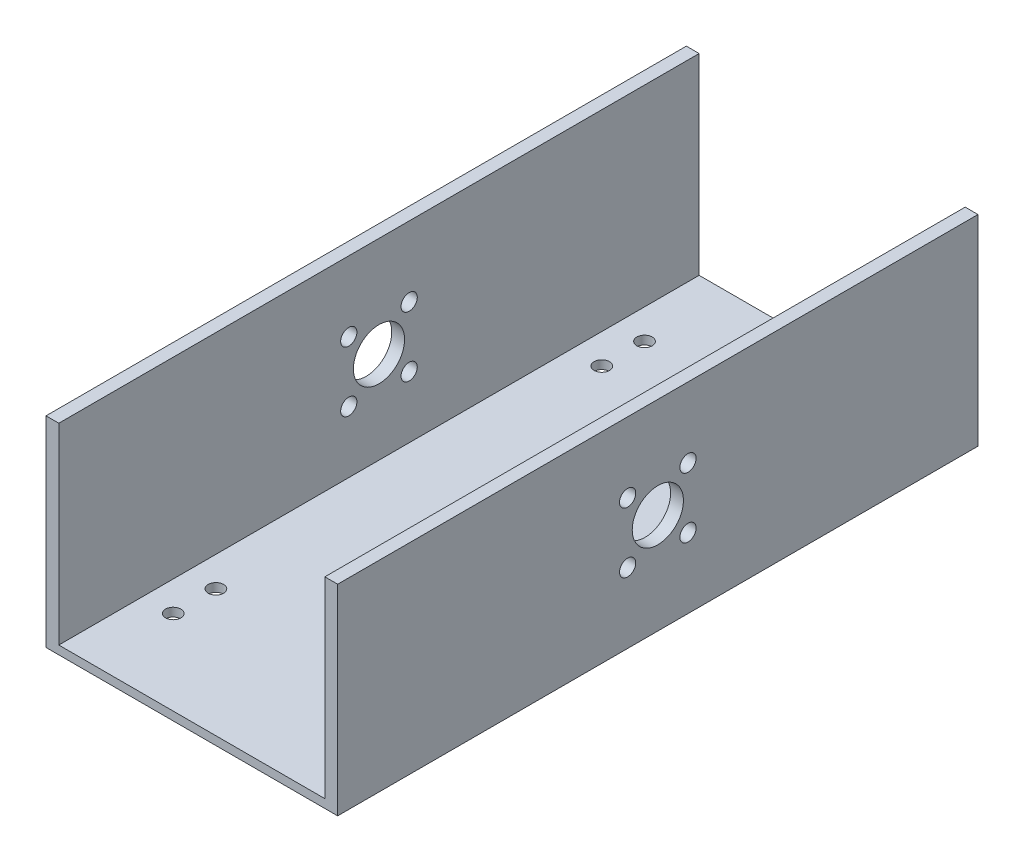
ISO-10303-21;
HEADER;
FILE_DESCRIPTION(('STEP AP214'),'2;1');
FILE_NAME('part.step','',(''),(''),'','','');
FILE_SCHEMA(('AUTOMOTIVE_DESIGN { 1 0 10303 214 1 1 1 1 }'));
ENDSEC;
DATA;
#1=APPLICATION_CONTEXT('core data for automotive mechanical design processes');
#2=APPLICATION_PROTOCOL_DEFINITION('international standard','automotive_design',2000,#1);
#3=PRODUCT_CONTEXT('',#1,'mechanical');
#4=PRODUCT('Part','Part','',(#3));
#5=PRODUCT_RELATED_PRODUCT_CATEGORY('part','',(#4));
#6=PRODUCT_DEFINITION_FORMATION('','',#4);
#7=PRODUCT_DEFINITION_CONTEXT('part definition',#1,'design');
#8=PRODUCT_DEFINITION('design','',#6,#7);
#9=PRODUCT_DEFINITION_SHAPE('','',#8);
#10=(LENGTH_UNIT() NAMED_UNIT(*) SI_UNIT(.MILLI.,.METRE.));
#11=(NAMED_UNIT(*) PLANE_ANGLE_UNIT() SI_UNIT($,.RADIAN.));
#12=(NAMED_UNIT(*) SI_UNIT($,.STERADIAN.) SOLID_ANGLE_UNIT());
#13=UNCERTAINTY_MEASURE_WITH_UNIT(LENGTH_MEASURE(1.E-05),#10,'distance_accuracy_value','');
#14=(GEOMETRIC_REPRESENTATION_CONTEXT(3) GLOBAL_UNCERTAINTY_ASSIGNED_CONTEXT((#13)) GLOBAL_UNIT_ASSIGNED_CONTEXT((#10,
#11,#12)) REPRESENTATION_CONTEXT('',''));
#15=CARTESIAN_POINT('',(0.,0.,0.));
#16=DIRECTION('',(0.,0.,1.));
#17=DIRECTION('',(1.,0.,0.));
#18=AXIS2_PLACEMENT_3D('',#15,#16,#17);
#19=CARTESIAN_POINT('',(0.,2.,0.));
#20=DIRECTION('',(0.,-1.,0.));
#21=DIRECTION('',(0.,0.,-1.));
#22=AXIS2_PLACEMENT_3D('',#19,#20,#21);
#23=PLANE('',#22);
#24=CARTESIAN_POINT('',(-24.16,2.,45.2));
#25=DIRECTION('',(0.,1.,0.));
#26=DIRECTION('',(0.,0.,-1.));
#27=AXIS2_PLACEMENT_3D('',#24,#25,#26);
#28=CIRCLE('',#27,1.8);
#29=CARTESIAN_POINT('',(-24.16,2.,43.4));
#30=VERTEX_POINT('',#29);
#31=EDGE_CURVE('E618',#30,#30,#28,.T.);
#32=ORIENTED_EDGE('',*,*,#31,.F.);
#33=EDGE_LOOP('',(#32));
#34=FACE_BOUND('',#33,.T.);
#35=CARTESIAN_POINT('',(24.16,2.,55.2));
#36=DIRECTION('',(0.,1.,0.));
#37=DIRECTION('',(0.,0.,-1.));
#38=AXIS2_PLACEMENT_3D('',#35,#36,#37);
#39=CIRCLE('',#38,1.8);
#40=CARTESIAN_POINT('',(24.16,2.,53.4));
#41=VERTEX_POINT('',#40);
#42=EDGE_CURVE('E606',#41,#41,#39,.T.);
#43=ORIENTED_EDGE('',*,*,#42,.F.);
#44=EDGE_LOOP('',(#43));
#45=FACE_BOUND('',#44,.T.);
#46=CARTESIAN_POINT('',(-24.16,2.,55.2));
#47=DIRECTION('',(0.,1.,0.));
#48=DIRECTION('',(0.,0.,-1.));
#49=AXIS2_PLACEMENT_3D('',#46,#47,#48);
#50=CIRCLE('',#49,1.8);
#51=CARTESIAN_POINT('',(-24.16,2.,53.4));
#52=VERTEX_POINT('',#51);
#53=EDGE_CURVE('E595',#52,#52,#50,.T.);
#54=ORIENTED_EDGE('',*,*,#53,.F.);
#55=EDGE_LOOP('',(#54));
#56=FACE_BOUND('',#55,.T.);
#57=CARTESIAN_POINT('',(24.16,2.,-45.2));
#58=DIRECTION('',(0.,1.,0.));
#59=DIRECTION('',(0.,0.,1.));
#60=AXIS2_PLACEMENT_3D('',#57,#58,#59);
#61=CIRCLE('',#60,1.79999999999999);
#62=CARTESIAN_POINT('',(24.16,2.,-43.4));
#63=VERTEX_POINT('',#62);
#64=EDGE_CURVE('E173',#63,#63,#61,.T.);
#65=ORIENTED_EDGE('',*,*,#64,.F.);
#66=EDGE_LOOP('',(#65));
#67=FACE_BOUND('',#66,.T.);
#68=CARTESIAN_POINT('',(24.16,2.,-55.2));
#69=DIRECTION('',(0.,1.,0.));
#70=DIRECTION('',(0.,0.,1.));
#71=AXIS2_PLACEMENT_3D('',#68,#69,#70);
#72=CIRCLE('',#71,1.8);
#73=CARTESIAN_POINT('',(24.16,2.,-53.4));
#74=VERTEX_POINT('',#73);
#75=EDGE_CURVE('E588',#74,#74,#72,.T.);
#76=ORIENTED_EDGE('',*,*,#75,.F.);
#77=EDGE_LOOP('',(#76));
#78=FACE_BOUND('',#77,.T.);
#79=CARTESIAN_POINT('',(-24.16,2.,-45.2));
#80=DIRECTION('',(0.,1.,0.));
#81=DIRECTION('',(0.,0.,1.));
#82=AXIS2_PLACEMENT_3D('',#79,#80,#81);
#83=CIRCLE('',#82,1.8);
#84=CARTESIAN_POINT('',(-24.16,2.,-43.4));
#85=VERTEX_POINT('',#84);
#86=EDGE_CURVE('E600',#85,#85,#83,.T.);
#87=ORIENTED_EDGE('',*,*,#86,.F.);
#88=EDGE_LOOP('',(#87));
#89=FACE_BOUND('',#88,.T.);
#90=CARTESIAN_POINT('',(-24.16,2.,-55.2));
#91=DIRECTION('',(0.,1.,0.));
#92=DIRECTION('',(0.,0.,1.));
#93=AXIS2_PLACEMENT_3D('',#90,#91,#92);
#94=CIRCLE('',#93,1.8);
#95=CARTESIAN_POINT('',(-24.16,2.,-53.4));
#96=VERTEX_POINT('',#95);
#97=EDGE_CURVE('E612',#96,#96,#94,.T.);
#98=ORIENTED_EDGE('',*,*,#97,.F.);
#99=EDGE_LOOP('',(#98));
#100=FACE_BOUND('',#99,.T.);
#101=CARTESIAN_POINT('',(24.16,2.,45.2));
#102=DIRECTION('',(0.,1.,0.));
#103=DIRECTION('',(0.,0.,-1.));
#104=AXIS2_PLACEMENT_3D('',#101,#102,#103);
#105=CIRCLE('',#104,1.79999999999999);
#106=CARTESIAN_POINT('',(24.16,2.,43.4));
#107=VERTEX_POINT('',#106);
#108=EDGE_CURVE('E144',#107,#107,#105,.T.);
#109=ORIENTED_EDGE('',*,*,#108,.F.);
#110=EDGE_LOOP('',(#109));
#111=FACE_BOUND('',#110,.T.);
#112=DIRECTION('',(0.,0.,1.));
#113=VECTOR('',#112,1.);
#114=CARTESIAN_POINT('',(31.16,2.,-75.));
#115=LINE('',#114,#113);
#116=CARTESIAN_POINT('',(31.16,2.,-75.));
#117=VERTEX_POINT('',#116);
#118=CARTESIAN_POINT('',(31.16,2.,75.));
#119=VERTEX_POINT('',#118);
#120=EDGE_CURVE('E105',#117,#119,#115,.T.);
#121=ORIENTED_EDGE('',*,*,#120,.F.);
#122=DIRECTION('',(-1.,0.,0.));
#123=VECTOR('',#122,1.);
#124=CARTESIAN_POINT('',(34.16,2.,-75.));
#125=LINE('',#124,#123);
#126=CARTESIAN_POINT('',(-31.16,2.,-75.));
#127=VERTEX_POINT('',#126);
#128=EDGE_CURVE('E159',#117,#127,#125,.T.);
#129=ORIENTED_EDGE('',*,*,#128,.T.);
#130=DIRECTION('',(0.,0.,-1.));
#131=VECTOR('',#130,1.);
#132=CARTESIAN_POINT('',(-31.16,2.,-75.));
#133=LINE('',#132,#131);
#134=CARTESIAN_POINT('',(-31.16,2.,75.));
#135=VERTEX_POINT('',#134);
#136=EDGE_CURVE('E55',#135,#127,#133,.T.);
#137=ORIENTED_EDGE('',*,*,#136,.F.);
#138=DIRECTION('',(1.,0.,0.));
#139=VECTOR('',#138,1.);
#140=CARTESIAN_POINT('',(34.16,2.,75.));
#141=LINE('',#140,#139);
#142=EDGE_CURVE('E50',#135,#119,#141,.T.);
#143=ORIENTED_EDGE('',*,*,#142,.T.);
#144=EDGE_LOOP('',(#121,#129,#137,#143));
#145=FACE_BOUND('',#144,.T.);
#146=ADVANCED_FACE('F33',(#34,#45,#56,#67,#78,#89,#100,#111,#145),#23,.F.);
#147=CARTESIAN_POINT('',(0.,0.,0.));
#148=DIRECTION('',(0.,-1.,0.));
#149=DIRECTION('',(0.,0.,-1.));
#150=AXIS2_PLACEMENT_3D('',#147,#148,#149);
#151=PLANE('',#150);
#152=CARTESIAN_POINT('',(-24.16,0.,45.2));
#153=DIRECTION('',(0.,1.,0.));
#154=DIRECTION('',(0.,0.,-1.));
#155=AXIS2_PLACEMENT_3D('',#152,#153,#154);
#156=CIRCLE('',#155,1.8);
#157=CARTESIAN_POINT('',(-24.16,0.,43.4));
#158=VERTEX_POINT('',#157);
#159=EDGE_CURVE('E621',#158,#158,#156,.T.);
#160=ORIENTED_EDGE('',*,*,#159,.T.);
#161=EDGE_LOOP('',(#160));
#162=FACE_BOUND('',#161,.T.);
#163=CARTESIAN_POINT('',(24.16,0.,55.2));
#164=DIRECTION('',(0.,1.,0.));
#165=DIRECTION('',(0.,0.,-1.));
#166=AXIS2_PLACEMENT_3D('',#163,#164,#165);
#167=CIRCLE('',#166,1.8);
#168=CARTESIAN_POINT('',(24.16,0.,53.4));
#169=VERTEX_POINT('',#168);
#170=EDGE_CURVE('E609',#169,#169,#167,.T.);
#171=ORIENTED_EDGE('',*,*,#170,.T.);
#172=EDGE_LOOP('',(#171));
#173=FACE_BOUND('',#172,.T.);
#174=CARTESIAN_POINT('',(-24.16,0.,55.2));
#175=DIRECTION('',(0.,1.,0.));
#176=DIRECTION('',(0.,0.,-1.));
#177=AXIS2_PLACEMENT_3D('',#174,#175,#176);
#178=CIRCLE('',#177,1.8);
#179=CARTESIAN_POINT('',(-24.16,0.,53.4));
#180=VERTEX_POINT('',#179);
#181=EDGE_CURVE('E597',#180,#180,#178,.T.);
#182=ORIENTED_EDGE('',*,*,#181,.T.);
#183=EDGE_LOOP('',(#182));
#184=FACE_BOUND('',#183,.T.);
#185=CARTESIAN_POINT('',(24.16,0.,-45.2));
#186=DIRECTION('',(0.,1.,0.));
#187=DIRECTION('',(0.,0.,1.));
#188=AXIS2_PLACEMENT_3D('',#185,#186,#187);
#189=CIRCLE('',#188,1.79999999999999);
#190=CARTESIAN_POINT('',(24.16,0.,-43.4));
#191=VERTEX_POINT('',#190);
#192=EDGE_CURVE('E586',#191,#191,#189,.T.);
#193=ORIENTED_EDGE('',*,*,#192,.T.);
#194=EDGE_LOOP('',(#193));
#195=FACE_BOUND('',#194,.T.);
#196=DIRECTION('',(0.,0.,1.));
#197=VECTOR('',#196,1.);
#198=CARTESIAN_POINT('',(-34.16,0.,-75.));
#199=LINE('',#198,#197);
#200=CARTESIAN_POINT('',(-34.16,0.,-75.));
#201=VERTEX_POINT('',#200);
#202=CARTESIAN_POINT('',(-34.16,0.,75.));
#203=VERTEX_POINT('',#202);
#204=EDGE_CURVE('E169',#201,#203,#199,.T.);
#205=ORIENTED_EDGE('',*,*,#204,.F.);
#206=DIRECTION('',(-1.,0.,0.));
#207=VECTOR('',#206,1.);
#208=CARTESIAN_POINT('',(34.16,0.,-75.));
#209=LINE('',#208,#207);
#210=CARTESIAN_POINT('',(34.16,0.,-75.));
#211=VERTEX_POINT('',#210);
#212=EDGE_CURVE('E177',#211,#201,#209,.T.);
#213=ORIENTED_EDGE('',*,*,#212,.F.);
#214=DIRECTION('',(0.,0.,-1.));
#215=VECTOR('',#214,1.);
#216=CARTESIAN_POINT('',(34.16,0.,-75.));
#217=LINE('',#216,#215);
#218=CARTESIAN_POINT('',(34.16,0.,75.));
#219=VERTEX_POINT('',#218);
#220=EDGE_CURVE('E175',#219,#211,#217,.T.);
#221=ORIENTED_EDGE('',*,*,#220,.F.);
#222=DIRECTION('',(1.,0.,0.));
#223=VECTOR('',#222,1.);
#224=CARTESIAN_POINT('',(34.16,0.,75.));
#225=LINE('',#224,#223);
#226=EDGE_CURVE('E172',#203,#219,#225,.T.);
#227=ORIENTED_EDGE('',*,*,#226,.F.);
#228=EDGE_LOOP('',(#205,#213,#221,#227));
#229=FACE_BOUND('',#228,.T.);
#230=CARTESIAN_POINT('',(24.16,0.,-55.2));
#231=DIRECTION('',(0.,1.,0.));
#232=DIRECTION('',(0.,0.,1.));
#233=AXIS2_PLACEMENT_3D('',#230,#231,#232);
#234=CIRCLE('',#233,1.8);
#235=CARTESIAN_POINT('',(24.16,0.,-53.4));
#236=VERTEX_POINT('',#235);
#237=EDGE_CURVE('E591',#236,#236,#234,.T.);
#238=ORIENTED_EDGE('',*,*,#237,.T.);
#239=EDGE_LOOP('',(#238));
#240=FACE_BOUND('',#239,.T.);
#241=CARTESIAN_POINT('',(-24.16,0.,-45.2));
#242=DIRECTION('',(0.,1.,0.));
#243=DIRECTION('',(0.,0.,1.));
#244=AXIS2_PLACEMENT_3D('',#241,#242,#243);
#245=CIRCLE('',#244,1.8);
#246=CARTESIAN_POINT('',(-24.16,0.,-43.4));
#247=VERTEX_POINT('',#246);
#248=EDGE_CURVE('E603',#247,#247,#245,.T.);
#249=ORIENTED_EDGE('',*,*,#248,.T.);
#250=EDGE_LOOP('',(#249));
#251=FACE_BOUND('',#250,.T.);
#252=CARTESIAN_POINT('',(-24.16,0.,-55.2));
#253=DIRECTION('',(0.,1.,0.));
#254=DIRECTION('',(0.,0.,1.));
#255=AXIS2_PLACEMENT_3D('',#252,#253,#254);
#256=CIRCLE('',#255,1.8);
#257=CARTESIAN_POINT('',(-24.16,0.,-53.4));
#258=VERTEX_POINT('',#257);
#259=EDGE_CURVE('E615',#258,#258,#256,.T.);
#260=ORIENTED_EDGE('',*,*,#259,.T.);
#261=EDGE_LOOP('',(#260));
#262=FACE_BOUND('',#261,.T.);
#263=CARTESIAN_POINT('',(24.16,0.,45.2));
#264=DIRECTION('',(0.,1.,0.));
#265=DIRECTION('',(0.,0.,-1.));
#266=AXIS2_PLACEMENT_3D('',#263,#264,#265);
#267=CIRCLE('',#266,1.79999999999999);
#268=CARTESIAN_POINT('',(24.16,0.,43.4));
#269=VERTEX_POINT('',#268);
#270=EDGE_CURVE('E156',#269,#269,#267,.T.);
#271=ORIENTED_EDGE('',*,*,#270,.T.);
#272=EDGE_LOOP('',(#271));
#273=FACE_BOUND('',#272,.T.);
#274=ADVANCED_FACE('F190',(#162,#173,#184,#195,#229,#240,#251,#262,#273),#151,.T.);
#275=CARTESIAN_POINT('',(-34.16,2.,-75.));
#276=DIRECTION('',(1.,0.,0.));
#277=DIRECTION('',(0.,0.,-1.));
#278=AXIS2_PLACEMENT_3D('',#275,#276,#277);
#279=PLANE('',#278);
#280=CARTESIAN_POINT('',(-34.16,16.4289321881345,7.0710678118655));
#281=DIRECTION('',(-1.,0.,0.));
#282=DIRECTION('',(0.,-1.,0.));
#283=AXIS2_PLACEMENT_3D('',#280,#281,#282);
#284=CIRCLE('',#283,1.89999999999999);
#285=CARTESIAN_POINT('',(-34.16,14.5289321881345,7.07106781186552));
#286=VERTEX_POINT('',#285);
#287=EDGE_CURVE('E247',#286,#286,#284,.T.);
#288=ORIENTED_EDGE('',*,*,#287,.F.);
#289=EDGE_LOOP('',(#288));
#290=FACE_BOUND('',#289,.T.);
#291=CARTESIAN_POINT('',(-34.16,16.4289321881346,-7.07106781186554));
#292=DIRECTION('',(-1.,0.,0.));
#293=DIRECTION('',(0.,0.,-1.));
#294=AXIS2_PLACEMENT_3D('',#291,#292,#293);
#295=CIRCLE('',#294,1.89999999999999);
#296=CARTESIAN_POINT('',(-34.16,16.4289321881346,-8.97106781186554));
#297=VERTEX_POINT('',#296);
#298=EDGE_CURVE('E251',#297,#297,#295,.T.);
#299=ORIENTED_EDGE('',*,*,#298,.F.);
#300=EDGE_LOOP('',(#299));
#301=FACE_BOUND('',#300,.T.);
#302=CARTESIAN_POINT('',(-34.16,30.5710678118655,-7.07106781186547));
#303=DIRECTION('',(-1.,0.,0.));
#304=DIRECTION('',(0.,1.,0.));
#305=AXIS2_PLACEMENT_3D('',#302,#303,#304);
#306=CIRCLE('',#305,1.89999999999999);
#307=CARTESIAN_POINT('',(-34.16,32.4710678118655,-7.07106781186548));
#308=VERTEX_POINT('',#307);
#309=EDGE_CURVE('E255',#308,#308,#306,.T.);
#310=ORIENTED_EDGE('',*,*,#309,.F.);
#311=EDGE_LOOP('',(#310));
#312=FACE_BOUND('',#311,.T.);
#313=CARTESIAN_POINT('',(-34.16,30.5710678118654,7.07106781186552));
#314=DIRECTION('',(-1.,0.,0.));
#315=DIRECTION('',(0.,0.,1.));
#316=AXIS2_PLACEMENT_3D('',#313,#314,#315);
#317=CIRCLE('',#316,1.89999999999999);
#318=CARTESIAN_POINT('',(-34.16,30.5710678118654,8.97106781186551));
#319=VERTEX_POINT('',#318);
#320=EDGE_CURVE('E259',#319,#319,#317,.T.);
#321=ORIENTED_EDGE('',*,*,#320,.F.);
#322=EDGE_LOOP('',(#321));
#323=FACE_BOUND('',#322,.T.);
#324=CARTESIAN_POINT('',(-34.16,23.5,0.));
#325=DIRECTION('',(-1.,0.,0.));
#326=DIRECTION('',(0.,0.,1.));
#327=AXIS2_PLACEMENT_3D('',#324,#325,#326);
#328=CIRCLE('',#327,6.);
#329=CARTESIAN_POINT('',(-34.16,23.5,5.99999999999999));
#330=VERTEX_POINT('',#329);
#331=EDGE_CURVE('E262',#330,#330,#328,.T.);
#332=ORIENTED_EDGE('',*,*,#331,.F.);
#333=EDGE_LOOP('',(#332));
#334=FACE_BOUND('',#333,.T.);
#335=ORIENTED_EDGE('',*,*,#204,.T.);
#336=DIRECTION('',(0.,-1.,0.));
#337=VECTOR('',#336,1.);
#338=CARTESIAN_POINT('',(-34.16,2.,75.));
#339=LINE('',#338,#337);
#340=CARTESIAN_POINT('',(-34.16,47.,75.));
#341=VERTEX_POINT('',#340);
#342=EDGE_CURVE('E11',#341,#203,#339,.T.);
#343=ORIENTED_EDGE('',*,*,#342,.F.);
#344=DIRECTION('',(0.,0.,1.));
#345=VECTOR('',#344,1.);
#346=CARTESIAN_POINT('',(-34.16,47.,-75.));
#347=LINE('',#346,#345);
#348=CARTESIAN_POINT('',(-34.16,47.,-75.));
#349=VERTEX_POINT('',#348);
#350=EDGE_CURVE('E122',#349,#341,#347,.T.);
#351=ORIENTED_EDGE('',*,*,#350,.F.);
#352=DIRECTION('',(0.,-1.,0.));
#353=VECTOR('',#352,1.);
#354=CARTESIAN_POINT('',(-34.16,2.,-75.));
#355=LINE('',#354,#353);
#356=EDGE_CURVE('E162',#349,#201,#355,.T.);
#357=ORIENTED_EDGE('',*,*,#356,.T.);
#358=EDGE_LOOP('',(#335,#343,#351,#357));
#359=FACE_BOUND('',#358,.T.);
#360=ADVANCED_FACE('F35',(#290,#301,#312,#323,#334,#359),#279,.F.);
#361=CARTESIAN_POINT('',(34.16,2.,75.));
#362=DIRECTION('',(0.,0.,-1.));
#363=DIRECTION('',(-1.,0.,0.));
#364=AXIS2_PLACEMENT_3D('',#361,#362,#363);
#365=PLANE('',#364);
#366=ORIENTED_EDGE('',*,*,#226,.T.);
#367=DIRECTION('',(0.,-1.,0.));
#368=VECTOR('',#367,1.);
#369=CARTESIAN_POINT('',(34.16,2.,75.));
#370=LINE('',#369,#368);
#371=CARTESIAN_POINT('',(34.16,47.,75.));
#372=VERTEX_POINT('',#371);
#373=EDGE_CURVE('E42',#372,#219,#370,.T.);
#374=ORIENTED_EDGE('',*,*,#373,.F.);
#375=DIRECTION('',(1.,0.,0.));
#376=VECTOR('',#375,1.);
#377=CARTESIAN_POINT('',(34.16,47.,75.));
#378=LINE('',#377,#376);
#379=CARTESIAN_POINT('',(31.16,47.,75.));
#380=VERTEX_POINT('',#379);
#381=EDGE_CURVE('E107',#380,#372,#378,.T.);
#382=ORIENTED_EDGE('',*,*,#381,.F.);
#383=DIRECTION('',(0.,-1.,0.));
#384=VECTOR('',#383,1.);
#385=CARTESIAN_POINT('',(31.16,197.0299970006,75.));
#386=LINE('',#385,#384);
#387=EDGE_CURVE('E98',#380,#119,#386,.T.);
#388=ORIENTED_EDGE('',*,*,#387,.T.);
#389=ORIENTED_EDGE('',*,*,#142,.F.);
#390=DIRECTION('',(0.,-1.,0.));
#391=VECTOR('',#390,1.);
#392=CARTESIAN_POINT('',(-31.16,47.,75.));
#393=LINE('',#392,#391);
#394=CARTESIAN_POINT('',(-31.16,47.,75.));
#395=VERTEX_POINT('',#394);
#396=EDGE_CURVE('E151',#395,#135,#393,.T.);
#397=ORIENTED_EDGE('',*,*,#396,.F.);
#398=DIRECTION('',(1.,0.,0.));
#399=VECTOR('',#398,1.);
#400=CARTESIAN_POINT('',(-34.16,47.,75.));
#401=LINE('',#400,#399);
#402=EDGE_CURVE('E134',#341,#395,#401,.T.);
#403=ORIENTED_EDGE('',*,*,#402,.F.);
#404=ORIENTED_EDGE('',*,*,#342,.T.);
#405=EDGE_LOOP('',(#366,#374,#382,#388,#389,#397,#403,#404));
#406=FACE_BOUND('',#405,.T.);
#407=ADVANCED_FACE('F110',(#406),#365,.F.);
#408=CARTESIAN_POINT('',(34.16,2.,-75.));
#409=DIRECTION('',(-1.,0.,0.));
#410=DIRECTION('',(0.,0.,1.));
#411=AXIS2_PLACEMENT_3D('',#408,#409,#410);
#412=PLANE('',#411);
#413=CARTESIAN_POINT('',(34.16,16.4289321881345,7.07106781186549));
#414=DIRECTION('',(-1.,0.,0.));
#415=DIRECTION('',(0.,-1.,0.));
#416=AXIS2_PLACEMENT_3D('',#413,#414,#415);
#417=CIRCLE('',#416,1.89999999999999);
#418=CARTESIAN_POINT('',(34.16,14.5289321881345,7.07106781186551));
#419=VERTEX_POINT('',#418);
#420=EDGE_CURVE('E560',#419,#419,#417,.T.);
#421=ORIENTED_EDGE('',*,*,#420,.T.);
#422=EDGE_LOOP('',(#421));
#423=FACE_BOUND('',#422,.T.);
#424=CARTESIAN_POINT('',(34.16,16.4289321881346,-7.07106781186555));
#425=DIRECTION('',(-1.,0.,0.));
#426=DIRECTION('',(0.,0.,-1.));
#427=AXIS2_PLACEMENT_3D('',#424,#425,#426);
#428=CIRCLE('',#427,1.89999999999999);
#429=CARTESIAN_POINT('',(34.16,16.4289321881346,-8.97106781186554));
#430=VERTEX_POINT('',#429);
#431=EDGE_CURVE('E320',#430,#430,#428,.T.);
#432=ORIENTED_EDGE('',*,*,#431,.T.);
#433=EDGE_LOOP('',(#432));
#434=FACE_BOUND('',#433,.T.);
#435=CARTESIAN_POINT('',(34.16,30.5710678118655,-7.07106781186548));
#436=DIRECTION('',(-1.,0.,0.));
#437=DIRECTION('',(0.,1.,0.));
#438=AXIS2_PLACEMENT_3D('',#435,#436,#437);
#439=CIRCLE('',#438,1.89999999999999);
#440=CARTESIAN_POINT('',(34.16,32.4710678118655,-7.07106781186549));
#441=VERTEX_POINT('',#440);
#442=EDGE_CURVE('E318',#441,#441,#439,.T.);
#443=ORIENTED_EDGE('',*,*,#442,.T.);
#444=EDGE_LOOP('',(#443));
#445=FACE_BOUND('',#444,.T.);
#446=CARTESIAN_POINT('',(34.16,30.5710678118654,7.07106781186551));
#447=DIRECTION('',(-1.,0.,0.));
#448=DIRECTION('',(0.,0.,1.));
#449=AXIS2_PLACEMENT_3D('',#446,#447,#448);
#450=CIRCLE('',#449,1.89999999999999);
#451=CARTESIAN_POINT('',(34.16,30.5710678118654,8.9710678118655));
#452=VERTEX_POINT('',#451);
#453=EDGE_CURVE('E313',#452,#452,#450,.T.);
#454=ORIENTED_EDGE('',*,*,#453,.T.);
#455=EDGE_LOOP('',(#454));
#456=FACE_BOUND('',#455,.T.);
#457=CARTESIAN_POINT('',(34.16,23.5,0.));
#458=DIRECTION('',(-1.,0.,0.));
#459=DIRECTION('',(0.,0.,1.));
#460=AXIS2_PLACEMENT_3D('',#457,#458,#459);
#461=CIRCLE('',#460,6.);
#462=CARTESIAN_POINT('',(34.16,23.5,5.99999999999998));
#463=VERTEX_POINT('',#462);
#464=EDGE_CURVE('E264',#463,#463,#461,.T.);
#465=ORIENTED_EDGE('',*,*,#464,.T.);
#466=EDGE_LOOP('',(#465));
#467=FACE_BOUND('',#466,.T.);
#468=ORIENTED_EDGE('',*,*,#220,.T.);
#469=DIRECTION('',(0.,-1.,0.));
#470=VECTOR('',#469,1.);
#471=CARTESIAN_POINT('',(34.16,2.,-75.));
#472=LINE('',#471,#470);
#473=CARTESIAN_POINT('',(34.16,47.,-75.));
#474=VERTEX_POINT('',#473);
#475=EDGE_CURVE('E181',#474,#211,#472,.T.);
#476=ORIENTED_EDGE('',*,*,#475,.F.);
#477=DIRECTION('',(0.,0.,-1.));
#478=VECTOR('',#477,1.);
#479=CARTESIAN_POINT('',(34.16,47.,-75.));
#480=LINE('',#479,#478);
#481=EDGE_CURVE('E115',#372,#474,#480,.T.);
#482=ORIENTED_EDGE('',*,*,#481,.F.);
#483=ORIENTED_EDGE('',*,*,#373,.T.);
#484=EDGE_LOOP('',(#468,#476,#482,#483));
#485=FACE_BOUND('',#484,.T.);
#486=ADVANCED_FACE('F186',(#423,#434,#445,#456,#467,#485),#412,.F.);
#487=CARTESIAN_POINT('',(34.16,2.,-75.));
#488=DIRECTION('',(0.,0.,1.));
#489=DIRECTION('',(1.,0.,0.));
#490=AXIS2_PLACEMENT_3D('',#487,#488,#489);
#491=PLANE('',#490);
#492=ORIENTED_EDGE('',*,*,#212,.T.);
#493=ORIENTED_EDGE('',*,*,#356,.F.);
#494=DIRECTION('',(-1.,0.,0.));
#495=VECTOR('',#494,1.);
#496=CARTESIAN_POINT('',(-34.16,47.,-75.));
#497=LINE('',#496,#495);
#498=CARTESIAN_POINT('',(-31.16,47.,-75.));
#499=VERTEX_POINT('',#498);
#500=EDGE_CURVE('E138',#499,#349,#497,.T.);
#501=ORIENTED_EDGE('',*,*,#500,.F.);
#502=DIRECTION('',(0.,-1.,0.));
#503=VECTOR('',#502,1.);
#504=CARTESIAN_POINT('',(-31.16,47.,-75.));
#505=LINE('',#504,#503);
#506=EDGE_CURVE('E141',#499,#127,#505,.T.);
#507=ORIENTED_EDGE('',*,*,#506,.T.);
#508=ORIENTED_EDGE('',*,*,#128,.F.);
#509=DIRECTION('',(0.,-1.,0.));
#510=VECTOR('',#509,1.);
#511=CARTESIAN_POINT('',(31.16,197.0299970006,-75.));
#512=LINE('',#511,#510);
#513=CARTESIAN_POINT('',(31.16,47.,-75.));
#514=VERTEX_POINT('',#513);
#515=EDGE_CURVE('E129',#514,#117,#512,.T.);
#516=ORIENTED_EDGE('',*,*,#515,.F.);
#517=DIRECTION('',(-1.,0.,0.));
#518=VECTOR('',#517,1.);
#519=CARTESIAN_POINT('',(34.16,47.,-75.));
#520=LINE('',#519,#518);
#521=EDGE_CURVE('E120',#474,#514,#520,.T.);
#522=ORIENTED_EDGE('',*,*,#521,.F.);
#523=ORIENTED_EDGE('',*,*,#475,.T.);
#524=EDGE_LOOP('',(#492,#493,#501,#507,#508,#516,#522,#523));
#525=FACE_BOUND('',#524,.T.);
#526=ADVANCED_FACE('F193',(#525),#491,.F.);
#527=CARTESIAN_POINT('',(24.16,2.,-45.2));
#528=DIRECTION('',(0.,-1.,0.));
#529=DIRECTION('',(0.,0.,-1.));
#530=AXIS2_PLACEMENT_3D('',#527,#528,#529);
#531=CYLINDRICAL_SURFACE('',#530,1.79999999999999);
#532=ORIENTED_EDGE('',*,*,#64,.T.);
#533=EDGE_LOOP('',(#532));
#534=FACE_BOUND('',#533,.T.);
#535=ORIENTED_EDGE('',*,*,#192,.F.);
#536=EDGE_LOOP('',(#535));
#537=FACE_BOUND('',#536,.T.);
#538=ADVANCED_FACE('F230',(#534,#537),#531,.F.);
#539=CARTESIAN_POINT('',(24.16,2.,-55.2));
#540=DIRECTION('',(0.,-1.,0.));
#541=DIRECTION('',(0.,0.,-1.));
#542=AXIS2_PLACEMENT_3D('',#539,#540,#541);
#543=CYLINDRICAL_SURFACE('',#542,1.8);
#544=ORIENTED_EDGE('',*,*,#75,.T.);
#545=EDGE_LOOP('',(#544));
#546=FACE_BOUND('',#545,.T.);
#547=ORIENTED_EDGE('',*,*,#237,.F.);
#548=EDGE_LOOP('',(#547));
#549=FACE_BOUND('',#548,.T.);
#550=ADVANCED_FACE('F451',(#546,#549),#543,.F.);
#551=CARTESIAN_POINT('',(-24.16,2.,55.2));
#552=DIRECTION('',(0.,-1.,0.));
#553=DIRECTION('',(0.,0.,-1.));
#554=AXIS2_PLACEMENT_3D('',#551,#552,#553);
#555=CYLINDRICAL_SURFACE('',#554,1.8);
#556=ORIENTED_EDGE('',*,*,#53,.T.);
#557=EDGE_LOOP('',(#556));
#558=FACE_BOUND('',#557,.T.);
#559=ORIENTED_EDGE('',*,*,#181,.F.);
#560=EDGE_LOOP('',(#559));
#561=FACE_BOUND('',#560,.T.);
#562=ADVANCED_FACE('F441',(#558,#561),#555,.F.);
#563=CARTESIAN_POINT('',(-24.16,2.,-45.2));
#564=DIRECTION('',(0.,-1.,0.));
#565=DIRECTION('',(0.,0.,-1.));
#566=AXIS2_PLACEMENT_3D('',#563,#564,#565);
#567=CYLINDRICAL_SURFACE('',#566,1.8);
#568=ORIENTED_EDGE('',*,*,#86,.T.);
#569=EDGE_LOOP('',(#568));
#570=FACE_BOUND('',#569,.T.);
#571=ORIENTED_EDGE('',*,*,#248,.F.);
#572=EDGE_LOOP('',(#571));
#573=FACE_BOUND('',#572,.T.);
#574=ADVANCED_FACE('F431',(#570,#573),#567,.F.);
#575=CARTESIAN_POINT('',(24.16,2.,55.2));
#576=DIRECTION('',(0.,-1.,0.));
#577=DIRECTION('',(0.,0.,-1.));
#578=AXIS2_PLACEMENT_3D('',#575,#576,#577);
#579=CYLINDRICAL_SURFACE('',#578,1.8);
#580=ORIENTED_EDGE('',*,*,#42,.T.);
#581=EDGE_LOOP('',(#580));
#582=FACE_BOUND('',#581,.T.);
#583=ORIENTED_EDGE('',*,*,#170,.F.);
#584=EDGE_LOOP('',(#583));
#585=FACE_BOUND('',#584,.T.);
#586=ADVANCED_FACE('F421',(#582,#585),#579,.F.);
#587=CARTESIAN_POINT('',(-24.16,2.,-55.2));
#588=DIRECTION('',(0.,-1.,0.));
#589=DIRECTION('',(0.,0.,-1.));
#590=AXIS2_PLACEMENT_3D('',#587,#588,#589);
#591=CYLINDRICAL_SURFACE('',#590,1.8);
#592=ORIENTED_EDGE('',*,*,#97,.T.);
#593=EDGE_LOOP('',(#592));
#594=FACE_BOUND('',#593,.T.);
#595=ORIENTED_EDGE('',*,*,#259,.F.);
#596=EDGE_LOOP('',(#595));
#597=FACE_BOUND('',#596,.T.);
#598=ADVANCED_FACE('F411',(#594,#597),#591,.F.);
#599=CARTESIAN_POINT('',(-24.16,2.,45.2));
#600=DIRECTION('',(0.,-1.,0.));
#601=DIRECTION('',(0.,0.,-1.));
#602=AXIS2_PLACEMENT_3D('',#599,#600,#601);
#603=CYLINDRICAL_SURFACE('',#602,1.8);
#604=ORIENTED_EDGE('',*,*,#31,.T.);
#605=EDGE_LOOP('',(#604));
#606=FACE_BOUND('',#605,.T.);
#607=ORIENTED_EDGE('',*,*,#159,.F.);
#608=EDGE_LOOP('',(#607));
#609=FACE_BOUND('',#608,.T.);
#610=ADVANCED_FACE('F214',(#606,#609),#603,.F.);
#611=CARTESIAN_POINT('',(24.16,2.,45.2));
#612=DIRECTION('',(0.,-1.,0.));
#613=DIRECTION('',(0.,0.,-1.));
#614=AXIS2_PLACEMENT_3D('',#611,#612,#613);
#615=CYLINDRICAL_SURFACE('',#614,1.79999999999999);
#616=ORIENTED_EDGE('',*,*,#108,.T.);
#617=EDGE_LOOP('',(#616));
#618=FACE_BOUND('',#617,.T.);
#619=ORIENTED_EDGE('',*,*,#270,.F.);
#620=EDGE_LOOP('',(#619));
#621=FACE_BOUND('',#620,.T.);
#622=ADVANCED_FACE('F206',(#618,#621),#615,.F.);
#623=CARTESIAN_POINT('',(-31.16,47.,-75.));
#624=DIRECTION('',(-1.,0.,0.));
#625=DIRECTION('',(0.,0.,1.));
#626=AXIS2_PLACEMENT_3D('',#623,#624,#625);
#627=PLANE('',#626);
#628=CARTESIAN_POINT('',(-31.16,16.4289321881345,7.0710678118655));
#629=DIRECTION('',(-1.,0.,0.));
#630=DIRECTION('',(0.,0.,1.));
#631=AXIS2_PLACEMENT_3D('',#628,#629,#630);
#632=CIRCLE('',#631,1.89999999999999);
#633=CARTESIAN_POINT('',(-31.16,16.4289321881345,8.97106781186549));
#634=VERTEX_POINT('',#633);
#635=EDGE_CURVE('E327',#634,#634,#632,.T.);
#636=ORIENTED_EDGE('',*,*,#635,.T.);
#637=EDGE_LOOP('',(#636));
#638=FACE_BOUND('',#637,.T.);
#639=CARTESIAN_POINT('',(-31.16,16.4289321881346,-7.07106781186554));
#640=DIRECTION('',(-1.,0.,0.));
#641=DIRECTION('',(0.,0.,1.));
#642=AXIS2_PLACEMENT_3D('',#639,#640,#641);
#643=CIRCLE('',#642,1.89999999999999);
#644=CARTESIAN_POINT('',(-31.16,16.4289321881346,-5.17106781186555));
#645=VERTEX_POINT('',#644);
#646=EDGE_CURVE('E319',#645,#645,#643,.T.);
#647=ORIENTED_EDGE('',*,*,#646,.T.);
#648=EDGE_LOOP('',(#647));
#649=FACE_BOUND('',#648,.T.);
#650=CARTESIAN_POINT('',(-31.16,30.5710678118655,-7.07106781186547));
#651=DIRECTION('',(-1.,0.,0.));
#652=DIRECTION('',(0.,0.,1.));
#653=AXIS2_PLACEMENT_3D('',#650,#651,#652);
#654=CIRCLE('',#653,1.89999999999999);
#655=CARTESIAN_POINT('',(-31.16,30.5710678118655,-5.17106781186548));
#656=VERTEX_POINT('',#655);
#657=EDGE_CURVE('E317',#656,#656,#654,.T.);
#658=ORIENTED_EDGE('',*,*,#657,.T.);
#659=EDGE_LOOP('',(#658));
#660=FACE_BOUND('',#659,.T.);
#661=CARTESIAN_POINT('',(-31.16,30.5710678118654,7.07106781186552));
#662=DIRECTION('',(-1.,0.,0.));
#663=DIRECTION('',(0.,0.,1.));
#664=AXIS2_PLACEMENT_3D('',#661,#662,#663);
#665=CIRCLE('',#664,1.89999999999999);
#666=CARTESIAN_POINT('',(-31.16,30.5710678118654,8.97106781186551));
#667=VERTEX_POINT('',#666);
#668=EDGE_CURVE('E265',#667,#667,#665,.T.);
#669=ORIENTED_EDGE('',*,*,#668,.T.);
#670=EDGE_LOOP('',(#669));
#671=FACE_BOUND('',#670,.T.);
#672=CARTESIAN_POINT('',(-31.16,23.5,0.));
#673=DIRECTION('',(-1.,0.,0.));
#674=DIRECTION('',(0.,0.,1.));
#675=AXIS2_PLACEMENT_3D('',#672,#673,#674);
#676=CIRCLE('',#675,6.);
#677=CARTESIAN_POINT('',(-31.16,23.5,5.99999999999999));
#678=VERTEX_POINT('',#677);
#679=EDGE_CURVE('E130',#678,#678,#676,.T.);
#680=ORIENTED_EDGE('',*,*,#679,.T.);
#681=EDGE_LOOP('',(#680));
#682=FACE_BOUND('',#681,.T.);
#683=ORIENTED_EDGE('',*,*,#136,.T.);
#684=ORIENTED_EDGE('',*,*,#506,.F.);
#685=DIRECTION('',(0.,0.,-1.));
#686=VECTOR('',#685,1.);
#687=CARTESIAN_POINT('',(-31.16,47.,-75.));
#688=LINE('',#687,#686);
#689=EDGE_CURVE('E136',#395,#499,#688,.T.);
#690=ORIENTED_EDGE('',*,*,#689,.F.);
#691=ORIENTED_EDGE('',*,*,#396,.T.);
#692=EDGE_LOOP('',(#683,#684,#690,#691));
#693=FACE_BOUND('',#692,.T.);
#694=ADVANCED_FACE('F204',(#638,#649,#660,#671,#682,#693),#627,.F.);
#695=CARTESIAN_POINT('',(0.,47.,0.));
#696=DIRECTION('',(0.,1.,0.));
#697=DIRECTION('',(0.,0.,1.));
#698=AXIS2_PLACEMENT_3D('',#695,#696,#697);
#699=PLANE('',#698);
#700=ORIENTED_EDGE('',*,*,#350,.T.);
#701=ORIENTED_EDGE('',*,*,#402,.T.);
#702=ORIENTED_EDGE('',*,*,#689,.T.);
#703=ORIENTED_EDGE('',*,*,#500,.T.);
#704=EDGE_LOOP('',(#700,#701,#702,#703));
#705=FACE_BOUND('',#704,.T.);
#706=ADVANCED_FACE('F199',(#705),#699,.T.);
#707=CARTESIAN_POINT('',(31.16,197.0299970006,-75.));
#708=DIRECTION('',(1.,0.,0.));
#709=DIRECTION('',(0.,0.,-1.));
#710=AXIS2_PLACEMENT_3D('',#707,#708,#709);
#711=PLANE('',#710);
#712=CARTESIAN_POINT('',(31.16,16.4289321881345,7.07106781186549));
#713=DIRECTION('',(1.,0.,0.));
#714=DIRECTION('',(0.,0.,-1.));
#715=AXIS2_PLACEMENT_3D('',#712,#713,#714);
#716=CIRCLE('',#715,1.89999999999999);
#717=CARTESIAN_POINT('',(31.16,16.4289321881345,5.1710678118655));
#718=VERTEX_POINT('',#717);
#719=EDGE_CURVE('E37',#718,#718,#716,.T.);
#720=ORIENTED_EDGE('',*,*,#719,.T.);
#721=EDGE_LOOP('',(#720));
#722=FACE_BOUND('',#721,.T.);
#723=CARTESIAN_POINT('',(31.16,16.4289321881346,-7.07106781186555));
#724=DIRECTION('',(1.,0.,0.));
#725=DIRECTION('',(0.,0.,-1.));
#726=AXIS2_PLACEMENT_3D('',#723,#724,#725);
#727=CIRCLE('',#726,1.89999999999999);
#728=CARTESIAN_POINT('',(31.16,16.4289321881346,-8.97106781186554));
#729=VERTEX_POINT('',#728);
#730=EDGE_CURVE('E305',#729,#729,#727,.T.);
#731=ORIENTED_EDGE('',*,*,#730,.T.);
#732=EDGE_LOOP('',(#731));
#733=FACE_BOUND('',#732,.T.);
#734=CARTESIAN_POINT('',(31.16,30.5710678118655,-7.07106781186548));
#735=DIRECTION('',(1.,0.,0.));
#736=DIRECTION('',(0.,0.,-1.));
#737=AXIS2_PLACEMENT_3D('',#734,#735,#736);
#738=CIRCLE('',#737,1.89999999999999);
#739=CARTESIAN_POINT('',(31.16,30.5710678118655,-8.97106781186547));
#740=VERTEX_POINT('',#739);
#741=EDGE_CURVE('E309',#740,#740,#738,.T.);
#742=ORIENTED_EDGE('',*,*,#741,.T.);
#743=EDGE_LOOP('',(#742));
#744=FACE_BOUND('',#743,.T.);
#745=CARTESIAN_POINT('',(31.16,30.5710678118654,7.07106781186551));
#746=DIRECTION('',(1.,0.,0.));
#747=DIRECTION('',(0.,0.,-1.));
#748=AXIS2_PLACEMENT_3D('',#745,#746,#747);
#749=CIRCLE('',#748,1.89999999999999);
#750=CARTESIAN_POINT('',(31.16,30.5710678118654,5.17106781186552));
#751=VERTEX_POINT('',#750);
#752=EDGE_CURVE('E270',#751,#751,#749,.T.);
#753=ORIENTED_EDGE('',*,*,#752,.T.);
#754=EDGE_LOOP('',(#753));
#755=FACE_BOUND('',#754,.T.);
#756=CARTESIAN_POINT('',(31.16,23.5,0.));
#757=DIRECTION('',(1.,0.,0.));
#758=DIRECTION('',(0.,0.,-1.));
#759=AXIS2_PLACEMENT_3D('',#756,#757,#758);
#760=CIRCLE('',#759,6.);
#761=CARTESIAN_POINT('',(31.16,23.5,-6.00000000000002));
#762=VERTEX_POINT('',#761);
#763=EDGE_CURVE('E163',#762,#762,#760,.T.);
#764=ORIENTED_EDGE('',*,*,#763,.T.);
#765=EDGE_LOOP('',(#764));
#766=FACE_BOUND('',#765,.T.);
#767=DIRECTION('',(0.,0.,1.));
#768=VECTOR('',#767,1.);
#769=CARTESIAN_POINT('',(31.16,47.,-75.));
#770=LINE('',#769,#768);
#771=EDGE_CURVE('E103',#514,#380,#770,.T.);
#772=ORIENTED_EDGE('',*,*,#771,.F.);
#773=ORIENTED_EDGE('',*,*,#515,.T.);
#774=ORIENTED_EDGE('',*,*,#120,.T.);
#775=ORIENTED_EDGE('',*,*,#387,.F.);
#776=EDGE_LOOP('',(#772,#773,#774,#775));
#777=FACE_BOUND('',#776,.T.);
#778=ADVANCED_FACE('F100',(#722,#733,#744,#755,#766,#777),#711,.F.);
#779=CARTESIAN_POINT('',(0.,47.,0.));
#780=DIRECTION('',(0.,1.,0.));
#781=DIRECTION('',(0.,0.,1.));
#782=AXIS2_PLACEMENT_3D('',#779,#780,#781);
#783=PLANE('',#782);
#784=ORIENTED_EDGE('',*,*,#381,.T.);
#785=ORIENTED_EDGE('',*,*,#481,.T.);
#786=ORIENTED_EDGE('',*,*,#521,.T.);
#787=ORIENTED_EDGE('',*,*,#771,.T.);
#788=EDGE_LOOP('',(#784,#785,#786,#787));
#789=FACE_BOUND('',#788,.T.);
#790=ADVANCED_FACE('F118',(#789),#783,.T.);
#791=CARTESIAN_POINT('',(34.16,23.5,0.));
#792=DIRECTION('',(-1.,0.,0.));
#793=DIRECTION('',(0.,0.,1.));
#794=AXIS2_PLACEMENT_3D('',#791,#792,#793);
#795=CYLINDRICAL_SURFACE('',#794,6.);
#796=ORIENTED_EDGE('',*,*,#464,.F.);
#797=EDGE_LOOP('',(#796));
#798=FACE_BOUND('',#797,.T.);
#799=ORIENTED_EDGE('',*,*,#763,.F.);
#800=EDGE_LOOP('',(#799));
#801=FACE_BOUND('',#800,.T.);
#802=ADVANCED_FACE('F279',(#798,#801),#795,.F.);
#803=ORIENTED_EDGE('',*,*,#331,.T.);
#804=EDGE_LOOP('',(#803));
#805=FACE_BOUND('',#804,.T.);
#806=ORIENTED_EDGE('',*,*,#679,.F.);
#807=EDGE_LOOP('',(#806));
#808=FACE_BOUND('',#807,.T.);
#809=ADVANCED_FACE('F281',(#805,#808),#795,.F.);
#810=CARTESIAN_POINT('',(34.16,30.5710678118654,7.07106781186551));
#811=DIRECTION('',(-1.,0.,0.));
#812=DIRECTION('',(0.,0.,1.));
#813=AXIS2_PLACEMENT_3D('',#810,#811,#812);
#814=CYLINDRICAL_SURFACE('',#813,1.89999999999999);
#815=ORIENTED_EDGE('',*,*,#453,.F.);
#816=EDGE_LOOP('',(#815));
#817=FACE_BOUND('',#816,.T.);
#818=ORIENTED_EDGE('',*,*,#752,.F.);
#819=EDGE_LOOP('',(#818));
#820=FACE_BOUND('',#819,.T.);
#821=ADVANCED_FACE('F288',(#817,#820),#814,.F.);
#822=ORIENTED_EDGE('',*,*,#320,.T.);
#823=EDGE_LOOP('',(#822));
#824=FACE_BOUND('',#823,.T.);
#825=ORIENTED_EDGE('',*,*,#668,.F.);
#826=EDGE_LOOP('',(#825));
#827=FACE_BOUND('',#826,.T.);
#828=ADVANCED_FACE('F293',(#824,#827),#814,.F.);
#829=CARTESIAN_POINT('',(34.16,30.5710678118655,-7.07106781186548));
#830=DIRECTION('',(-1.,0.,0.));
#831=DIRECTION('',(0.,0.,1.));
#832=AXIS2_PLACEMENT_3D('',#829,#830,#831);
#833=CYLINDRICAL_SURFACE('',#832,1.89999999999999);
#834=ORIENTED_EDGE('',*,*,#442,.F.);
#835=EDGE_LOOP('',(#834));
#836=FACE_BOUND('',#835,.T.);
#837=ORIENTED_EDGE('',*,*,#741,.F.);
#838=EDGE_LOOP('',(#837));
#839=FACE_BOUND('',#838,.T.);
#840=ADVANCED_FACE('F340',(#836,#839),#833,.F.);
#841=ORIENTED_EDGE('',*,*,#309,.T.);
#842=EDGE_LOOP('',(#841));
#843=FACE_BOUND('',#842,.T.);
#844=ORIENTED_EDGE('',*,*,#657,.F.);
#845=EDGE_LOOP('',(#844));
#846=FACE_BOUND('',#845,.T.);
#847=ADVANCED_FACE('F347',(#843,#846),#833,.F.);
#848=CARTESIAN_POINT('',(34.16,16.4289321881346,-7.07106781186555));
#849=DIRECTION('',(-1.,0.,0.));
#850=DIRECTION('',(0.,0.,1.));
#851=AXIS2_PLACEMENT_3D('',#848,#849,#850);
#852=CYLINDRICAL_SURFACE('',#851,1.89999999999999);
#853=ORIENTED_EDGE('',*,*,#431,.F.);
#854=EDGE_LOOP('',(#853));
#855=FACE_BOUND('',#854,.T.);
#856=ORIENTED_EDGE('',*,*,#730,.F.);
#857=EDGE_LOOP('',(#856));
#858=FACE_BOUND('',#857,.T.);
#859=ADVANCED_FACE('F517',(#855,#858),#852,.F.);
#860=ORIENTED_EDGE('',*,*,#298,.T.);
#861=EDGE_LOOP('',(#860));
#862=FACE_BOUND('',#861,.T.);
#863=ORIENTED_EDGE('',*,*,#646,.F.);
#864=EDGE_LOOP('',(#863));
#865=FACE_BOUND('',#864,.T.);
#866=ADVANCED_FACE('F526',(#862,#865),#852,.F.);
#867=CARTESIAN_POINT('',(34.16,16.4289321881345,7.07106781186549));
#868=DIRECTION('',(-1.,0.,0.));
#869=DIRECTION('',(0.,0.,1.));
#870=AXIS2_PLACEMENT_3D('',#867,#868,#869);
#871=CYLINDRICAL_SURFACE('',#870,1.89999999999999);
#872=ORIENTED_EDGE('',*,*,#420,.F.);
#873=EDGE_LOOP('',(#872));
#874=FACE_BOUND('',#873,.T.);
#875=ORIENTED_EDGE('',*,*,#719,.F.);
#876=EDGE_LOOP('',(#875));
#877=FACE_BOUND('',#876,.T.);
#878=ADVANCED_FACE('F536',(#874,#877),#871,.F.);
#879=ORIENTED_EDGE('',*,*,#287,.T.);
#880=EDGE_LOOP('',(#879));
#881=FACE_BOUND('',#880,.T.);
#882=ORIENTED_EDGE('',*,*,#635,.F.);
#883=EDGE_LOOP('',(#882));
#884=FACE_BOUND('',#883,.T.);
#885=ADVANCED_FACE('F545',(#881,#884),#871,.F.);
#886=CLOSED_SHELL('',(#146,#274,#360,#407,#486,#526,#538,#550,#562,#574,#586,#598,#610,#622,
#694,#706,#778,#790,#802,#809,#821,#828,#840,#847,#859,#866,#878,#885));
#887=MANIFOLD_SOLID_BREP('B2',#886);
#888=ADVANCED_BREP_SHAPE_REPRESENTATION('',(#18,#887),#14);
#889=SHAPE_DEFINITION_REPRESENTATION(#9,#888);
ENDSEC;
END-ISO-10303-21;
